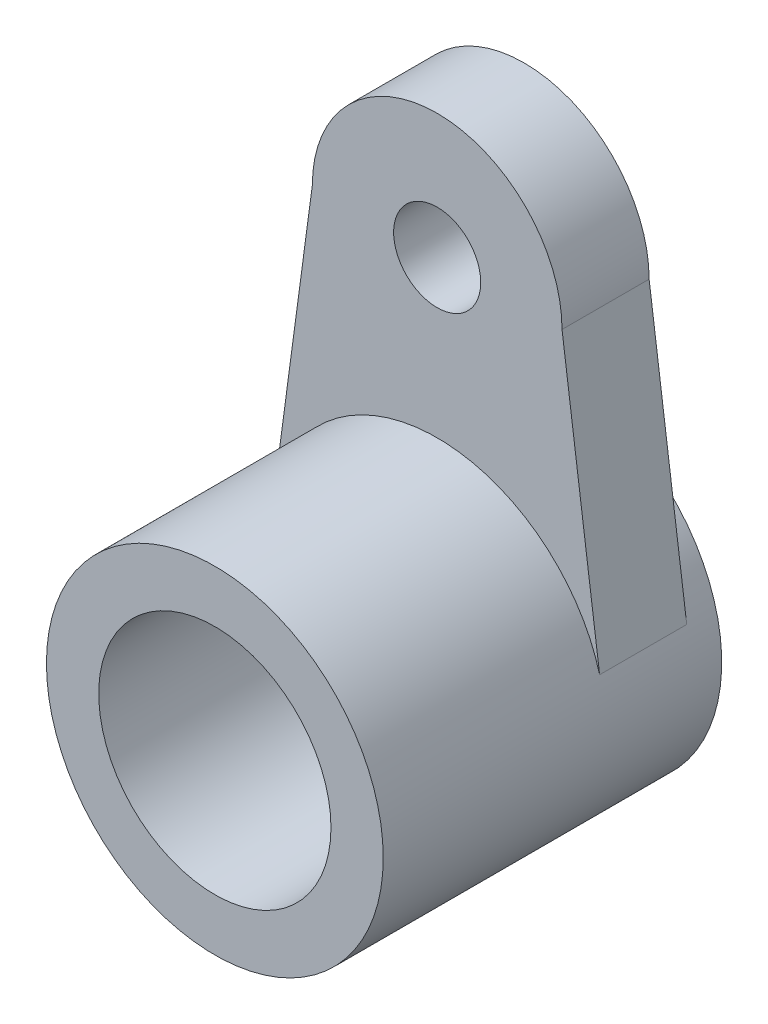
ISO-10303-21;
HEADER;
FILE_DESCRIPTION(('STEP AP214'),'2;1');
FILE_NAME('part.step','',(''),(''),'','','');
FILE_SCHEMA(('AUTOMOTIVE_DESIGN { 1 0 10303 214 1 1 1 1 }'));
ENDSEC;
DATA;
#1=APPLICATION_CONTEXT('core data for automotive mechanical design processes');
#2=APPLICATION_PROTOCOL_DEFINITION('international standard','automotive_design',2000,#1);
#3=PRODUCT_CONTEXT('',#1,'mechanical');
#4=PRODUCT('Part','Part','',(#3));
#5=PRODUCT_RELATED_PRODUCT_CATEGORY('part','',(#4));
#6=PRODUCT_DEFINITION_FORMATION('','',#4);
#7=PRODUCT_DEFINITION_CONTEXT('part definition',#1,'design');
#8=PRODUCT_DEFINITION('design','',#6,#7);
#9=PRODUCT_DEFINITION_SHAPE('','',#8);
#10=(LENGTH_UNIT() NAMED_UNIT(*) SI_UNIT(.MILLI.,.METRE.));
#11=(NAMED_UNIT(*) PLANE_ANGLE_UNIT() SI_UNIT($,.RADIAN.));
#12=(NAMED_UNIT(*) SI_UNIT($,.STERADIAN.) SOLID_ANGLE_UNIT());
#13=UNCERTAINTY_MEASURE_WITH_UNIT(LENGTH_MEASURE(1.E-05),#10,'distance_accuracy_value','');
#14=(GEOMETRIC_REPRESENTATION_CONTEXT(3) GLOBAL_UNCERTAINTY_ASSIGNED_CONTEXT((#13)) GLOBAL_UNIT_ASSIGNED_CONTEXT((#10,
#11,#12)) REPRESENTATION_CONTEXT('',''));
#15=CARTESIAN_POINT('',(0.,0.,0.));
#16=DIRECTION('',(0.,0.,1.));
#17=DIRECTION('',(1.,0.,0.));
#18=AXIS2_PLACEMENT_3D('',#15,#16,#17);
#19=CARTESIAN_POINT('',(0.,-5.59,0.));
#20=DIRECTION('',(0.,0.,1.));
#21=DIRECTION('',(1.,0.,0.));
#22=AXIS2_PLACEMENT_3D('',#19,#20,#21);
#23=PLANE('',#22);
#24=CARTESIAN_POINT('',(0.,0.,0.));
#25=DIRECTION('',(0.,0.,1.));
#26=DIRECTION('',(1.,0.,0.));
#27=AXIS2_PLACEMENT_3D('',#24,#25,#26);
#28=CIRCLE('',#27,0.75);
#29=CARTESIAN_POINT('',(0.75,0.,0.));
#30=VERTEX_POINT('',#29);
#31=EDGE_CURVE('E139',#30,#30,#28,.T.);
#32=ORIENTED_EDGE('',*,*,#31,.T.);
#33=EDGE_LOOP('',(#32));
#34=FACE_BOUND('',#33,.T.);
#35=CARTESIAN_POINT('',(0.,-5.59,0.));
#36=DIRECTION('',(0.,0.,-1.));
#37=DIRECTION('',(-1.,0.,0.));
#38=AXIS2_PLACEMENT_3D('',#35,#36,#37);
#39=CIRCLE('',#38,2.9);
#40=CARTESIAN_POINT('',(-2.79743984709499,-4.82558499368135,0.));
#41=VERTEX_POINT('',#40);
#42=CARTESIAN_POINT('',(2.79743984709499,-4.82558499368136,0.));
#43=VERTEX_POINT('',#42);
#44=EDGE_CURVE('E91',#41,#43,#39,.T.);
#45=ORIENTED_EDGE('',*,*,#44,.F.);
#46=DIRECTION('',(-0.132976633224119,-0.991119172963765,0.));
#47=VECTOR('',#46,1.);
#48=CARTESIAN_POINT('',(-2.15,0.,0.));
#49=LINE('',#48,#47);
#50=CARTESIAN_POINT('',(-2.15,0.,0.));
#51=VERTEX_POINT('',#50);
#52=EDGE_CURVE('E93',#51,#41,#49,.T.);
#53=ORIENTED_EDGE('',*,*,#52,.F.);
#54=CARTESIAN_POINT('',(0.,0.,0.));
#55=DIRECTION('',(0.,0.,1.));
#56=DIRECTION('',(1.,0.,0.));
#57=AXIS2_PLACEMENT_3D('',#54,#55,#56);
#58=CIRCLE('',#57,2.15);
#59=CARTESIAN_POINT('',(2.15,0.,0.));
#60=VERTEX_POINT('',#59);
#61=EDGE_CURVE('E79',#60,#51,#58,.T.);
#62=ORIENTED_EDGE('',*,*,#61,.F.);
#63=DIRECTION('',(-0.132976633224119,0.991119172963765,0.));
#64=VECTOR('',#63,1.);
#65=CARTESIAN_POINT('',(2.15,0.,0.));
#66=LINE('',#65,#64);
#67=EDGE_CURVE('E73',#43,#60,#66,.T.);
#68=ORIENTED_EDGE('',*,*,#67,.F.);
#69=EDGE_LOOP('',(#45,#53,#62,#68));
#70=FACE_BOUND('',#69,.T.);
#71=ADVANCED_FACE('F41',(#34,#70),#23,.F.);
#72=CARTESIAN_POINT('',(0.,-5.59,1.5));
#73=DIRECTION('',(0.,0.,-1.));
#74=DIRECTION('',(-1.,0.,0.));
#75=AXIS2_PLACEMENT_3D('',#72,#73,#74);
#76=CYLINDRICAL_SURFACE('',#75,2.9);
#77=DIRECTION('',(0.,0.,-1.));
#78=VECTOR('',#77,1.);
#79=CARTESIAN_POINT('',(-2.79743984709499,-4.82558499368135,1.5));
#80=LINE('',#79,#78);
#81=CARTESIAN_POINT('',(-2.79743984709499,-4.82558499368135,1.5));
#82=VERTEX_POINT('',#81);
#83=EDGE_CURVE('E101',#82,#41,#80,.T.);
#84=ORIENTED_EDGE('',*,*,#83,.T.);
#85=ORIENTED_EDGE('',*,*,#44,.T.);
#86=DIRECTION('',(0.,0.,-1.));
#87=VECTOR('',#86,1.);
#88=CARTESIAN_POINT('',(2.79743984709499,-4.82558499368136,1.5));
#89=LINE('',#88,#87);
#90=CARTESIAN_POINT('',(2.79743984709499,-4.82558499368136,1.5));
#91=VERTEX_POINT('',#90);
#92=EDGE_CURVE('E11',#91,#43,#89,.T.);
#93=ORIENTED_EDGE('',*,*,#92,.F.);
#94=CARTESIAN_POINT('',(0.,-5.59,1.5));
#95=DIRECTION('',(0.,0.,1.));
#96=DIRECTION('',(1.,0.,0.));
#97=AXIS2_PLACEMENT_3D('',#94,#95,#96);
#98=CIRCLE('',#97,2.9);
#99=EDGE_CURVE('E106',#91,#82,#98,.T.);
#100=ORIENTED_EDGE('',*,*,#99,.T.);
#101=EDGE_LOOP('',(#84,#85,#93,#100));
#102=FACE_BOUND('',#101,.T.);
#103=CARTESIAN_POINT('',(0.,-5.59,5.329));
#104=DIRECTION('',(0.,0.,1.));
#105=DIRECTION('',(1.,0.,0.));
#106=AXIS2_PLACEMENT_3D('',#103,#104,#105);
#107=CIRCLE('',#106,2.9);
#108=CARTESIAN_POINT('',(2.9,-5.59,5.329));
#109=VERTEX_POINT('',#108);
#110=EDGE_CURVE('E115',#109,#109,#107,.T.);
#111=ORIENTED_EDGE('',*,*,#110,.F.);
#112=EDGE_LOOP('',(#111));
#113=FACE_BOUND('',#112,.T.);
#114=CARTESIAN_POINT('',(0.,-5.59,-0.5));
#115=DIRECTION('',(0.,0.,-1.));
#116=DIRECTION('',(-1.,0.,0.));
#117=AXIS2_PLACEMENT_3D('',#114,#115,#116);
#118=CIRCLE('',#117,2.9);
#119=CARTESIAN_POINT('',(-2.9,-5.59,-0.5));
#120=VERTEX_POINT('',#119);
#121=EDGE_CURVE('E96',#120,#120,#118,.T.);
#122=ORIENTED_EDGE('',*,*,#121,.F.);
#123=EDGE_LOOP('',(#122));
#124=FACE_BOUND('',#123,.T.);
#125=ADVANCED_FACE('F43',(#102,#113,#124),#76,.T.);
#126=CARTESIAN_POINT('',(2.15,0.,1.5));
#127=DIRECTION('',(-0.991119172963765,-0.132976633224119,0.));
#128=DIRECTION('',(0.132976633224119,-0.991119172963766,0.));
#129=AXIS2_PLACEMENT_3D('',#126,#127,#128);
#130=PLANE('',#129);
#131=ORIENTED_EDGE('',*,*,#67,.T.);
#132=DIRECTION('',(0.,0.,-1.));
#133=VECTOR('',#132,1.);
#134=CARTESIAN_POINT('',(2.15,0.,1.5));
#135=LINE('',#134,#133);
#136=CARTESIAN_POINT('',(2.15,0.,1.5));
#137=VERTEX_POINT('',#136);
#138=EDGE_CURVE('E51',#137,#60,#135,.T.);
#139=ORIENTED_EDGE('',*,*,#138,.F.);
#140=DIRECTION('',(-0.132976633224119,0.991119172963765,0.));
#141=VECTOR('',#140,1.);
#142=CARTESIAN_POINT('',(2.15,0.,1.5));
#143=LINE('',#142,#141);
#144=EDGE_CURVE('E83',#91,#137,#143,.T.);
#145=ORIENTED_EDGE('',*,*,#144,.F.);
#146=ORIENTED_EDGE('',*,*,#92,.T.);
#147=EDGE_LOOP('',(#131,#139,#145,#146));
#148=FACE_BOUND('',#147,.T.);
#149=ADVANCED_FACE('F169',(#148),#130,.F.);
#150=CARTESIAN_POINT('',(0.,0.,1.5));
#151=DIRECTION('',(0.,0.,-1.));
#152=DIRECTION('',(-1.,0.,0.));
#153=AXIS2_PLACEMENT_3D('',#150,#151,#152);
#154=CYLINDRICAL_SURFACE('',#153,2.15);
#155=ORIENTED_EDGE('',*,*,#61,.T.);
#156=DIRECTION('',(0.,0.,-1.));
#157=VECTOR('',#156,1.);
#158=CARTESIAN_POINT('',(-2.15,0.,1.5));
#159=LINE('',#158,#157);
#160=CARTESIAN_POINT('',(-2.15,0.,1.5));
#161=VERTEX_POINT('',#160);
#162=EDGE_CURVE('E103',#161,#51,#159,.T.);
#163=ORIENTED_EDGE('',*,*,#162,.F.);
#164=CARTESIAN_POINT('',(0.,0.,1.5));
#165=DIRECTION('',(0.,0.,1.));
#166=DIRECTION('',(1.,0.,0.));
#167=AXIS2_PLACEMENT_3D('',#164,#165,#166);
#168=CIRCLE('',#167,2.15);
#169=EDGE_CURVE('E109',#137,#161,#168,.T.);
#170=ORIENTED_EDGE('',*,*,#169,.F.);
#171=ORIENTED_EDGE('',*,*,#138,.T.);
#172=EDGE_LOOP('',(#155,#163,#170,#171));
#173=FACE_BOUND('',#172,.T.);
#174=ADVANCED_FACE('F114',(#173),#154,.T.);
#175=CARTESIAN_POINT('',(-2.15,0.,1.5));
#176=DIRECTION('',(0.991119172963765,-0.132976633224119,0.));
#177=DIRECTION('',(0.132976633224119,0.991119172963766,0.));
#178=AXIS2_PLACEMENT_3D('',#175,#176,#177);
#179=PLANE('',#178);
#180=ORIENTED_EDGE('',*,*,#52,.T.);
#181=ORIENTED_EDGE('',*,*,#83,.F.);
#182=DIRECTION('',(-0.132976633224119,-0.991119172963765,0.));
#183=VECTOR('',#182,1.);
#184=CARTESIAN_POINT('',(-2.15,0.,1.5));
#185=LINE('',#184,#183);
#186=EDGE_CURVE('E59',#161,#82,#185,.T.);
#187=ORIENTED_EDGE('',*,*,#186,.F.);
#188=ORIENTED_EDGE('',*,*,#162,.T.);
#189=EDGE_LOOP('',(#180,#181,#187,#188));
#190=FACE_BOUND('',#189,.T.);
#191=ADVANCED_FACE('F100',(#190),#179,.F.);
#192=CARTESIAN_POINT('',(0.,-5.59,1.5));
#193=DIRECTION('',(0.,0.,1.));
#194=DIRECTION('',(1.,0.,0.));
#195=AXIS2_PLACEMENT_3D('',#192,#193,#194);
#196=PLANE('',#195);
#197=CARTESIAN_POINT('',(0.,0.,1.5));
#198=DIRECTION('',(0.,0.,1.));
#199=DIRECTION('',(1.,0.,0.));
#200=AXIS2_PLACEMENT_3D('',#197,#198,#199);
#201=CIRCLE('',#200,0.75);
#202=CARTESIAN_POINT('',(0.75,0.,1.5));
#203=VERTEX_POINT('',#202);
#204=EDGE_CURVE('E142',#203,#203,#201,.T.);
#205=ORIENTED_EDGE('',*,*,#204,.F.);
#206=EDGE_LOOP('',(#205));
#207=FACE_BOUND('',#206,.T.);
#208=ORIENTED_EDGE('',*,*,#99,.F.);
#209=ORIENTED_EDGE('',*,*,#144,.T.);
#210=ORIENTED_EDGE('',*,*,#169,.T.);
#211=ORIENTED_EDGE('',*,*,#186,.T.);
#212=EDGE_LOOP('',(#208,#209,#210,#211));
#213=FACE_BOUND('',#212,.T.);
#214=ADVANCED_FACE('F149',(#207,#213),#196,.T.);
#215=CARTESIAN_POINT('',(0.,-5.59,5.329));
#216=DIRECTION('',(0.,0.,1.));
#217=DIRECTION('',(1.,0.,0.));
#218=AXIS2_PLACEMENT_3D('',#215,#216,#217);
#219=PLANE('',#218);
#220=CARTESIAN_POINT('',(0.,-5.59,5.329));
#221=DIRECTION('',(0.,0.,1.));
#222=DIRECTION('',(1.,0.,0.));
#223=AXIS2_PLACEMENT_3D('',#220,#221,#222);
#224=CIRCLE('',#223,2.);
#225=CARTESIAN_POINT('',(2.,-5.59,5.329));
#226=VERTEX_POINT('',#225);
#227=EDGE_CURVE('E125',#226,#226,#224,.T.);
#228=ORIENTED_EDGE('',*,*,#227,.F.);
#229=EDGE_LOOP('',(#228));
#230=FACE_BOUND('',#229,.T.);
#231=ORIENTED_EDGE('',*,*,#110,.T.);
#232=EDGE_LOOP('',(#231));
#233=FACE_BOUND('',#232,.T.);
#234=ADVANCED_FACE('F151',(#230,#233),#219,.T.);
#235=CARTESIAN_POINT('',(0.,-5.59,-0.5));
#236=DIRECTION('',(0.,0.,-1.));
#237=DIRECTION('',(-1.,0.,0.));
#238=AXIS2_PLACEMENT_3D('',#235,#236,#237);
#239=PLANE('',#238);
#240=CARTESIAN_POINT('',(0.,-5.59,-0.5));
#241=DIRECTION('',(0.,0.,-1.));
#242=DIRECTION('',(-1.,0.,0.));
#243=AXIS2_PLACEMENT_3D('',#240,#241,#242);
#244=CIRCLE('',#243,2.);
#245=CARTESIAN_POINT('',(-2.,-5.59,-0.5));
#246=VERTEX_POINT('',#245);
#247=EDGE_CURVE('E131',#246,#246,#244,.T.);
#248=ORIENTED_EDGE('',*,*,#247,.F.);
#249=EDGE_LOOP('',(#248));
#250=FACE_BOUND('',#249,.T.);
#251=ORIENTED_EDGE('',*,*,#121,.T.);
#252=EDGE_LOOP('',(#251));
#253=FACE_BOUND('',#252,.T.);
#254=ADVANCED_FACE('F158',(#250,#253),#239,.T.);
#255=CARTESIAN_POINT('',(0.,-5.59,2.329));
#256=DIRECTION('',(0.,0.,1.));
#257=DIRECTION('',(1.,0.,0.));
#258=AXIS2_PLACEMENT_3D('',#255,#256,#257);
#259=CYLINDRICAL_SURFACE('',#258,2.);
#260=CARTESIAN_POINT('',(0.,-5.59,2.329));
#261=DIRECTION('',(0.,0.,1.));
#262=DIRECTION('',(1.,0.,0.));
#263=AXIS2_PLACEMENT_3D('',#260,#261,#262);
#264=CIRCLE('',#263,2.);
#265=CARTESIAN_POINT('',(2.,-5.59,2.329));
#266=VERTEX_POINT('',#265);
#267=EDGE_CURVE('E97',#266,#266,#264,.T.);
#268=ORIENTED_EDGE('',*,*,#267,.F.);
#269=EDGE_LOOP('',(#268));
#270=FACE_BOUND('',#269,.T.);
#271=ORIENTED_EDGE('',*,*,#227,.T.);
#272=EDGE_LOOP('',(#271));
#273=FACE_BOUND('',#272,.T.);
#274=ADVANCED_FACE('F195',(#270,#273),#259,.F.);
#275=CARTESIAN_POINT('',(0.,-5.59,2.329));
#276=DIRECTION('',(0.,0.,1.));
#277=DIRECTION('',(1.,0.,0.));
#278=AXIS2_PLACEMENT_3D('',#275,#276,#277);
#279=PLANE('',#278);
#280=CARTESIAN_POINT('',(0.,-5.59,2.329));
#281=DIRECTION('',(0.,0.,1.));
#282=DIRECTION('',(1.,0.,0.));
#283=AXIS2_PLACEMENT_3D('',#280,#281,#282);
#284=CIRCLE('',#283,1.1);
#285=CARTESIAN_POINT('',(1.1,-5.59,2.329));
#286=VERTEX_POINT('',#285);
#287=EDGE_CURVE('E45',#286,#286,#284,.T.);
#288=ORIENTED_EDGE('',*,*,#287,.F.);
#289=EDGE_LOOP('',(#288));
#290=FACE_BOUND('',#289,.T.);
#291=ORIENTED_EDGE('',*,*,#267,.T.);
#292=EDGE_LOOP('',(#291));
#293=FACE_BOUND('',#292,.T.);
#294=ADVANCED_FACE('F199',(#290,#293),#279,.T.);
#295=CARTESIAN_POINT('',(0.,-5.59,0.2));
#296=DIRECTION('',(0.,0.,-1.));
#297=DIRECTION('',(-1.,0.,0.));
#298=AXIS2_PLACEMENT_3D('',#295,#296,#297);
#299=CYLINDRICAL_SURFACE('',#298,2.);
#300=CARTESIAN_POINT('',(0.,-5.59,0.2));
#301=DIRECTION('',(0.,0.,-1.));
#302=DIRECTION('',(-1.,0.,0.));
#303=AXIS2_PLACEMENT_3D('',#300,#301,#302);
#304=CIRCLE('',#303,2.);
#305=CARTESIAN_POINT('',(-2.,-5.59,0.2));
#306=VERTEX_POINT('',#305);
#307=EDGE_CURVE('E128',#306,#306,#304,.T.);
#308=ORIENTED_EDGE('',*,*,#307,.F.);
#309=EDGE_LOOP('',(#308));
#310=FACE_BOUND('',#309,.T.);
#311=ORIENTED_EDGE('',*,*,#247,.T.);
#312=EDGE_LOOP('',(#311));
#313=FACE_BOUND('',#312,.T.);
#314=ADVANCED_FACE('F214',(#310,#313),#299,.F.);
#315=CARTESIAN_POINT('',(0.,-5.59,0.2));
#316=DIRECTION('',(0.,0.,-1.));
#317=DIRECTION('',(-1.,0.,0.));
#318=AXIS2_PLACEMENT_3D('',#315,#316,#317);
#319=PLANE('',#318);
#320=CARTESIAN_POINT('',(0.,-5.59,0.2));
#321=DIRECTION('',(0.,0.,-1.));
#322=DIRECTION('',(-1.,0.,0.));
#323=AXIS2_PLACEMENT_3D('',#320,#321,#322);
#324=CIRCLE('',#323,1.1);
#325=CARTESIAN_POINT('',(-1.1,-5.59,0.2));
#326=VERTEX_POINT('',#325);
#327=EDGE_CURVE('E136',#326,#326,#324,.T.);
#328=ORIENTED_EDGE('',*,*,#327,.F.);
#329=EDGE_LOOP('',(#328));
#330=FACE_BOUND('',#329,.T.);
#331=ORIENTED_EDGE('',*,*,#307,.T.);
#332=EDGE_LOOP('',(#331));
#333=FACE_BOUND('',#332,.T.);
#334=ADVANCED_FACE('F218',(#330,#333),#319,.T.);
#335=CARTESIAN_POINT('',(0.,-5.59,3.9));
#336=DIRECTION('',(0.,0.,-1.));
#337=DIRECTION('',(-1.,0.,0.));
#338=AXIS2_PLACEMENT_3D('',#335,#336,#337);
#339=CYLINDRICAL_SURFACE('',#338,1.1);
#340=ORIENTED_EDGE('',*,*,#287,.T.);
#341=EDGE_LOOP('',(#340));
#342=FACE_BOUND('',#341,.T.);
#343=ORIENTED_EDGE('',*,*,#327,.T.);
#344=EDGE_LOOP('',(#343));
#345=FACE_BOUND('',#344,.T.);
#346=ADVANCED_FACE('F233',(#342,#345),#339,.F.);
#347=CARTESIAN_POINT('',(0.,0.,-2.2));
#348=DIRECTION('',(0.,0.,1.));
#349=DIRECTION('',(1.,0.,0.));
#350=AXIS2_PLACEMENT_3D('',#347,#348,#349);
#351=CYLINDRICAL_SURFACE('',#350,0.75);
#352=ORIENTED_EDGE('',*,*,#204,.T.);
#353=EDGE_LOOP('',(#352));
#354=FACE_BOUND('',#353,.T.);
#355=ORIENTED_EDGE('',*,*,#31,.F.);
#356=EDGE_LOOP('',(#355));
#357=FACE_BOUND('',#356,.T.);
#358=ADVANCED_FACE('F146',(#354,#357),#351,.F.);
#359=CLOSED_SHELL('',(#71,#125,#149,#174,#191,#214,#234,#254,#274,#294,#314,#334,#346,#358));
#360=MANIFOLD_SOLID_BREP('B2',#359);
#361=ADVANCED_BREP_SHAPE_REPRESENTATION('',(#18,#360),#14);
#362=SHAPE_DEFINITION_REPRESENTATION(#9,#361);
ENDSEC;
END-ISO-10303-21;
